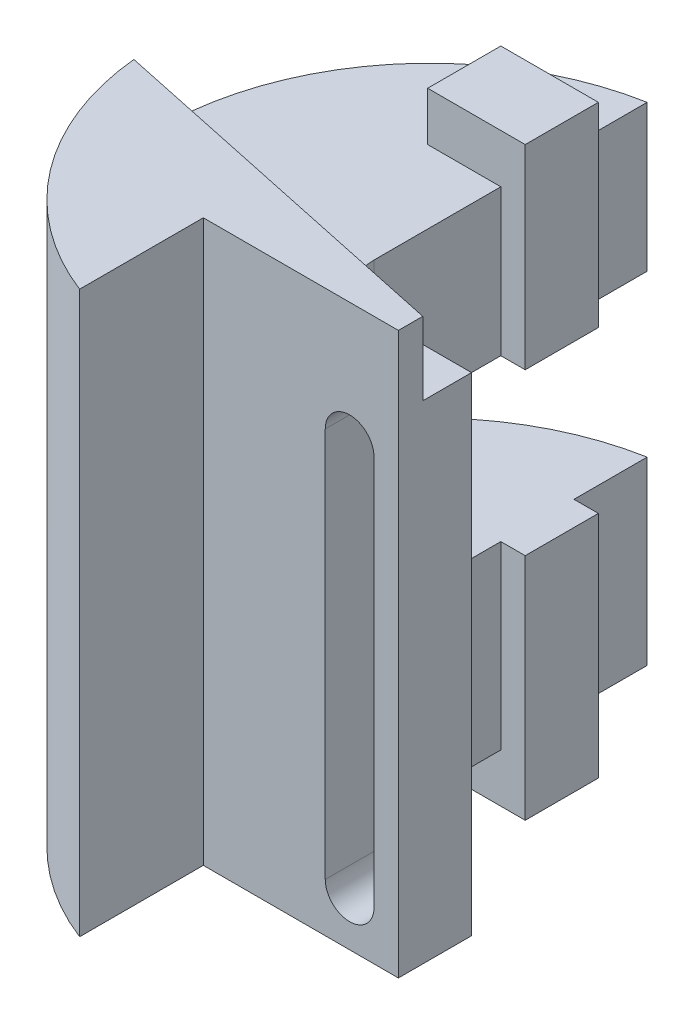
ISO-10303-21;
HEADER;
FILE_DESCRIPTION(('STEP AP214'),'2;1');
FILE_NAME('part.step','',(''),(''),'','','');
FILE_SCHEMA(('AUTOMOTIVE_DESIGN { 1 0 10303 214 1 1 1 1 }'));
ENDSEC;
DATA;
#1=APPLICATION_CONTEXT('core data for automotive mechanical design processes');
#2=APPLICATION_PROTOCOL_DEFINITION('international standard','automotive_design',2000,#1);
#3=PRODUCT_CONTEXT('',#1,'mechanical');
#4=PRODUCT('Part','Part','',(#3));
#5=PRODUCT_RELATED_PRODUCT_CATEGORY('part','',(#4));
#6=PRODUCT_DEFINITION_FORMATION('','',#4);
#7=PRODUCT_DEFINITION_CONTEXT('part definition',#1,'design');
#8=PRODUCT_DEFINITION('design','',#6,#7);
#9=PRODUCT_DEFINITION_SHAPE('','',#8);
#10=(LENGTH_UNIT() NAMED_UNIT(*) SI_UNIT(.MILLI.,.METRE.));
#11=(NAMED_UNIT(*) PLANE_ANGLE_UNIT() SI_UNIT($,.RADIAN.));
#12=(NAMED_UNIT(*) SI_UNIT($,.STERADIAN.) SOLID_ANGLE_UNIT());
#13=UNCERTAINTY_MEASURE_WITH_UNIT(LENGTH_MEASURE(1.E-05),#10,'distance_accuracy_value','');
#14=(GEOMETRIC_REPRESENTATION_CONTEXT(3) GLOBAL_UNCERTAINTY_ASSIGNED_CONTEXT((#13)) GLOBAL_UNIT_ASSIGNED_CONTEXT((#10,
#11,#12)) REPRESENTATION_CONTEXT('',''));
#15=CARTESIAN_POINT('',(0.,0.,0.));
#16=DIRECTION('',(0.,0.,1.));
#17=DIRECTION('',(1.,0.,0.));
#18=AXIS2_PLACEMENT_3D('',#15,#16,#17);
#19=CARTESIAN_POINT('',(5.,100.,30.));
#20=DIRECTION('',(0.,0.,-1.));
#21=DIRECTION('',(-1.,0.,0.));
#22=AXIS2_PLACEMENT_3D('',#19,#20,#21);
#23=PLANE('',#22);
#24=DIRECTION('',(0.,-1.,0.));
#25=VECTOR('',#24,1.);
#26=CARTESIAN_POINT('',(5.,100.,30.));
#27=LINE('',#26,#25);
#28=CARTESIAN_POINT('',(5.,37.,30.));
#29=VERTEX_POINT('',#28);
#30=CARTESIAN_POINT('',(5.,-10.,30.));
#31=VERTEX_POINT('',#30);
#32=EDGE_CURVE('E259',#29,#31,#27,.T.);
#33=ORIENTED_EDGE('',*,*,#32,.F.);
#34=DIRECTION('',(-1.,0.,0.));
#35=VECTOR('',#34,1.);
#36=CARTESIAN_POINT('',(5.,37.,30.));
#37=LINE('',#36,#35);
#38=CARTESIAN_POINT('',(0.,37.,30.));
#39=VERTEX_POINT('',#38);
#40=EDGE_CURVE('E515',#29,#39,#37,.T.);
#41=ORIENTED_EDGE('',*,*,#40,.T.);
#42=DIRECTION('',(0.,-1.,0.));
#43=VECTOR('',#42,1.);
#44=CARTESIAN_POINT('',(0.,100.,30.));
#45=LINE('',#44,#43);
#46=CARTESIAN_POINT('',(0.,0.,30.));
#47=VERTEX_POINT('',#46);
#48=EDGE_CURVE('E270',#39,#47,#45,.T.);
#49=ORIENTED_EDGE('',*,*,#48,.T.);
#50=DIRECTION('',(-1.,0.,0.));
#51=VECTOR('',#50,1.);
#52=CARTESIAN_POINT('',(5.,0.,30.));
#53=LINE('',#52,#51);
#54=CARTESIAN_POINT('',(-15.,0.,30.));
#55=VERTEX_POINT('',#54);
#56=EDGE_CURVE('E299',#47,#55,#53,.T.);
#57=ORIENTED_EDGE('',*,*,#56,.T.);
#58=DIRECTION('',(0.,1.,0.));
#59=VECTOR('',#58,1.);
#60=CARTESIAN_POINT('',(-15.,-10.,30.));
#61=LINE('',#60,#59);
#62=CARTESIAN_POINT('',(-15.,-10.,30.));
#63=VERTEX_POINT('',#62);
#64=EDGE_CURVE('E439',#63,#55,#61,.T.);
#65=ORIENTED_EDGE('',*,*,#64,.F.);
#66=DIRECTION('',(-1.,0.,0.));
#67=VECTOR('',#66,1.);
#68=CARTESIAN_POINT('',(5.,-10.,30.));
#69=LINE('',#68,#67);
#70=EDGE_CURVE('E478',#31,#63,#69,.T.);
#71=ORIENTED_EDGE('',*,*,#70,.F.);
#72=EDGE_LOOP('',(#33,#41,#49,#57,#65,#71));
#73=FACE_BOUND('',#72,.T.);
#74=ADVANCED_FACE('F45',(#73),#23,.F.);
#75=CARTESIAN_POINT('',(5.,100.,15.));
#76=DIRECTION('',(-1.,0.,0.));
#77=DIRECTION('',(0.,0.,1.));
#78=AXIS2_PLACEMENT_3D('',#75,#76,#77);
#79=PLANE('',#78);
#80=DIRECTION('',(0.,-1.,0.));
#81=VECTOR('',#80,1.);
#82=CARTESIAN_POINT('',(5.,100.,15.));
#83=LINE('',#82,#81);
#84=CARTESIAN_POINT('',(5.,37.,15.));
#85=VERTEX_POINT('',#84);
#86=CARTESIAN_POINT('',(5.,-10.,15.));
#87=VERTEX_POINT('',#86);
#88=EDGE_CURVE('E260',#85,#87,#83,.T.);
#89=ORIENTED_EDGE('',*,*,#88,.F.);
#90=DIRECTION('',(0.,0.,-1.));
#91=VECTOR('',#90,1.);
#92=CARTESIAN_POINT('',(5.,37.,40.));
#93=LINE('',#92,#91);
#94=EDGE_CURVE('E252',#29,#85,#93,.T.);
#95=ORIENTED_EDGE('',*,*,#94,.F.);
#96=ORIENTED_EDGE('',*,*,#32,.T.);
#97=DIRECTION('',(0.,0.,1.));
#98=VECTOR('',#97,1.);
#99=CARTESIAN_POINT('',(5.,-10.,15.));
#100=LINE('',#99,#98);
#101=EDGE_CURVE('E463',#87,#31,#100,.T.);
#102=ORIENTED_EDGE('',*,*,#101,.F.);
#103=EDGE_LOOP('',(#89,#95,#96,#102));
#104=FACE_BOUND('',#103,.T.);
#105=ADVANCED_FACE('F545',(#104),#79,.F.);
#106=CARTESIAN_POINT('',(0.,100.,15.));
#107=DIRECTION('',(0.,0.,1.));
#108=DIRECTION('',(1.,0.,0.));
#109=AXIS2_PLACEMENT_3D('',#106,#107,#108);
#110=PLANE('',#109);
#111=DIRECTION('',(0.,-1.,0.));
#112=VECTOR('',#111,1.);
#113=CARTESIAN_POINT('',(0.,100.,15.));
#114=LINE('',#113,#112);
#115=CARTESIAN_POINT('',(0.,37.,15.));
#116=VERTEX_POINT('',#115);
#117=CARTESIAN_POINT('',(0.,0.,15.));
#118=VERTEX_POINT('',#117);
#119=EDGE_CURVE('E311',#116,#118,#114,.T.);
#120=ORIENTED_EDGE('',*,*,#119,.F.);
#121=DIRECTION('',(1.,0.,0.));
#122=VECTOR('',#121,1.);
#123=CARTESIAN_POINT('',(0.,37.,15.));
#124=LINE('',#123,#122);
#125=EDGE_CURVE('E320',#116,#85,#124,.T.);
#126=ORIENTED_EDGE('',*,*,#125,.T.);
#127=ORIENTED_EDGE('',*,*,#88,.T.);
#128=DIRECTION('',(1.,0.,0.));
#129=VECTOR('',#128,1.);
#130=CARTESIAN_POINT('',(-15.,-10.,15.));
#131=LINE('',#130,#129);
#132=CARTESIAN_POINT('',(-15.,-10.,15.));
#133=VERTEX_POINT('',#132);
#134=EDGE_CURVE('E460',#133,#87,#131,.T.);
#135=ORIENTED_EDGE('',*,*,#134,.F.);
#136=DIRECTION('',(0.,1.,0.));
#137=VECTOR('',#136,1.);
#138=CARTESIAN_POINT('',(-15.,-10.,15.));
#139=LINE('',#138,#137);
#140=CARTESIAN_POINT('',(-15.,0.,15.));
#141=VERTEX_POINT('',#140);
#142=EDGE_CURVE('E457',#133,#141,#139,.T.);
#143=ORIENTED_EDGE('',*,*,#142,.T.);
#144=DIRECTION('',(1.,0.,0.));
#145=VECTOR('',#144,1.);
#146=CARTESIAN_POINT('',(-15.,0.,15.));
#147=LINE('',#146,#145);
#148=EDGE_CURVE('E323',#141,#118,#147,.T.);
#149=ORIENTED_EDGE('',*,*,#148,.T.);
#150=EDGE_LOOP('',(#120,#126,#127,#135,#143,#149));
#151=FACE_BOUND('',#150,.T.);
#152=ADVANCED_FACE('F319',(#151),#110,.F.);
#153=CARTESIAN_POINT('',(0.,100.,0.));
#154=DIRECTION('',(-1.,0.,0.));
#155=DIRECTION('',(0.,0.,1.));
#156=AXIS2_PLACEMENT_3D('',#153,#154,#155);
#157=PLANE('',#156);
#158=DIRECTION('',(0.,-1.,0.));
#159=VECTOR('',#158,1.);
#160=CARTESIAN_POINT('',(0.,100.,0.));
#161=LINE('',#160,#159);
#162=CARTESIAN_POINT('',(0.,37.,0.));
#163=VERTEX_POINT('',#162);
#164=CARTESIAN_POINT('',(0.,0.,0.));
#165=VERTEX_POINT('',#164);
#166=EDGE_CURVE('E313',#163,#165,#161,.T.);
#167=ORIENTED_EDGE('',*,*,#166,.F.);
#168=DIRECTION('',(0.,0.,1.));
#169=VECTOR('',#168,1.);
#170=CARTESIAN_POINT('',(0.,37.,0.));
#171=LINE('',#170,#169);
#172=EDGE_CURVE('E54',#163,#116,#171,.T.);
#173=ORIENTED_EDGE('',*,*,#172,.T.);
#174=ORIENTED_EDGE('',*,*,#119,.T.);
#175=DIRECTION('',(0.,0.,-1.));
#176=VECTOR('',#175,1.);
#177=CARTESIAN_POINT('',(0.,0.,0.));
#178=LINE('',#177,#176);
#179=EDGE_CURVE('E335',#118,#165,#178,.T.);
#180=ORIENTED_EDGE('',*,*,#179,.T.);
#181=EDGE_LOOP('',(#167,#173,#174,#180));
#182=FACE_BOUND('',#181,.T.);
#183=ADVANCED_FACE('F309',(#182),#157,.F.);
#184=CARTESIAN_POINT('',(10.,100.,54.5916660306315));
#185=DIRECTION('',(0.,1.,0.));
#186=DIRECTION('',(0.,0.,1.));
#187=AXIS2_PLACEMENT_3D('',#184,#185,#186);
#188=PLANE('',#187);
#189=DIRECTION('',(0.,0.,1.));
#190=VECTOR('',#189,1.);
#191=CARTESIAN_POINT('',(-15.,100.,15.));
#192=LINE('',#191,#190);
#193=CARTESIAN_POINT('',(-15.,100.,15.));
#194=VERTEX_POINT('',#193);
#195=CARTESIAN_POINT('',(-15.,100.,30.));
#196=VERTEX_POINT('',#195);
#197=EDGE_CURVE('E494',#194,#196,#192,.T.);
#198=ORIENTED_EDGE('',*,*,#197,.F.);
#199=DIRECTION('',(1.,0.,0.));
#200=VECTOR('',#199,1.);
#201=CARTESIAN_POINT('',(10.,100.,15.));
#202=LINE('',#201,#200);
#203=CARTESIAN_POINT('',(0.,100.,15.));
#204=VERTEX_POINT('',#203);
#205=EDGE_CURVE('E300',#194,#204,#202,.T.);
#206=ORIENTED_EDGE('',*,*,#205,.T.);
#207=DIRECTION('',(0.,0.,-1.));
#208=VECTOR('',#207,1.);
#209=CARTESIAN_POINT('',(0.,100.,0.));
#210=LINE('',#209,#208);
#211=CARTESIAN_POINT('',(0.,100.,0.));
#212=VERTEX_POINT('',#211);
#213=EDGE_CURVE('E333',#204,#212,#210,.T.);
#214=ORIENTED_EDGE('',*,*,#213,.T.);
#215=CARTESIAN_POINT('',(10.,100.,54.5916660306315));
#216=DIRECTION('',(0.,1.,0.));
#217=DIRECTION('',(0.,0.,1.));
#218=AXIS2_PLACEMENT_3D('',#215,#216,#217);
#219=CIRCLE('',#218,55.5);
#220=CARTESIAN_POINT('',(-45.2350441418964,100.,60.0082977001064));
#221=VERTEX_POINT('',#220);
#222=EDGE_CURVE('E338',#212,#221,#219,.T.);
#223=ORIENTED_EDGE('',*,*,#222,.T.);
#224=DIRECTION('',(-0.978147600733806,0.,-0.207911690817756));
#225=VECTOR('',#224,1.);
#226=CARTESIAN_POINT('',(30.,100.,76.));
#227=LINE('',#226,#225);
#228=CARTESIAN_POINT('',(30.,100.,76.));
#229=VERTEX_POINT('',#228);
#230=EDGE_CURVE('E388',#229,#221,#227,.T.);
#231=ORIENTED_EDGE('',*,*,#230,.F.);
#232=DIRECTION('',(0.,0.,-1.));
#233=VECTOR('',#232,1.);
#234=CARTESIAN_POINT('',(30.,100.,66.));
#235=LINE('',#234,#233);
#236=CARTESIAN_POINT('',(30.,100.,66.));
#237=VERTEX_POINT('',#236);
#238=EDGE_CURVE('E375',#229,#237,#235,.T.);
#239=ORIENTED_EDGE('',*,*,#238,.T.);
#240=DIRECTION('',(-1.,0.,0.));
#241=VECTOR('',#240,1.);
#242=CARTESIAN_POINT('',(10.,100.,66.));
#243=LINE('',#242,#241);
#244=CARTESIAN_POINT('',(10.,100.,66.));
#245=VERTEX_POINT('',#244);
#246=EDGE_CURVE('E372',#237,#245,#243,.T.);
#247=ORIENTED_EDGE('',*,*,#246,.T.);
#248=CARTESIAN_POINT('',(10.,100.,56.));
#249=DIRECTION('',(0.,-1.,0.));
#250=DIRECTION('',(0.,0.,1.));
#251=AXIS2_PLACEMENT_3D('',#248,#249,#250);
#252=CIRCLE('',#251,10.);
#253=CARTESIAN_POINT('',(0.,100.,56.));
#254=VERTEX_POINT('',#253);
#255=EDGE_CURVE('E369',#245,#254,#252,.T.);
#256=ORIENTED_EDGE('',*,*,#255,.T.);
#257=DIRECTION('',(0.,0.,-1.));
#258=VECTOR('',#257,1.);
#259=CARTESIAN_POINT('',(0.,100.,30.));
#260=LINE('',#259,#258);
#261=CARTESIAN_POINT('',(0.,100.,30.));
#262=VERTEX_POINT('',#261);
#263=EDGE_CURVE('E365',#254,#262,#260,.T.);
#264=ORIENTED_EDGE('',*,*,#263,.T.);
#265=DIRECTION('',(1.,0.,0.));
#266=VECTOR('',#265,1.);
#267=CARTESIAN_POINT('',(-15.,100.,30.));
#268=LINE('',#267,#266);
#269=EDGE_CURVE('E490',#196,#262,#268,.T.);
#270=ORIENTED_EDGE('',*,*,#269,.F.);
#271=EDGE_LOOP('',(#198,#206,#214,#223,#231,#239,#247,#256,#264,#270));
#272=FACE_BOUND('',#271,.T.);
#273=ADVANCED_FACE('F604',(#272),#188,.T.);
#274=CARTESIAN_POINT('',(10.,0.,54.5916660306315));
#275=DIRECTION('',(0.,1.,0.));
#276=DIRECTION('',(0.,0.,1.));
#277=AXIS2_PLACEMENT_3D('',#274,#275,#276);
#278=PLANE('',#277);
#279=ORIENTED_EDGE('',*,*,#148,.F.);
#280=DIRECTION('',(0.,0.,-1.));
#281=VECTOR('',#280,1.);
#282=CARTESIAN_POINT('',(-15.,0.,30.));
#283=LINE('',#282,#281);
#284=EDGE_CURVE('E464',#55,#141,#283,.T.);
#285=ORIENTED_EDGE('',*,*,#284,.F.);
#286=ORIENTED_EDGE('',*,*,#56,.F.);
#287=DIRECTION('',(0.,0.,-1.));
#288=VECTOR('',#287,1.);
#289=CARTESIAN_POINT('',(0.,0.,30.));
#290=LINE('',#289,#288);
#291=CARTESIAN_POINT('',(0.,0.,56.));
#292=VERTEX_POINT('',#291);
#293=EDGE_CURVE('E339',#292,#47,#290,.T.);
#294=ORIENTED_EDGE('',*,*,#293,.F.);
#295=CARTESIAN_POINT('',(10.,0.,56.));
#296=DIRECTION('',(0.,-1.,0.));
#297=DIRECTION('',(0.,0.,1.));
#298=AXIS2_PLACEMENT_3D('',#295,#296,#297);
#299=CIRCLE('',#298,10.);
#300=CARTESIAN_POINT('',(10.,0.,66.));
#301=VERTEX_POINT('',#300);
#302=EDGE_CURVE('E343',#301,#292,#299,.T.);
#303=ORIENTED_EDGE('',*,*,#302,.F.);
#304=DIRECTION('',(-1.,0.,0.));
#305=VECTOR('',#304,1.);
#306=CARTESIAN_POINT('',(10.,0.,66.));
#307=LINE('',#306,#305);
#308=CARTESIAN_POINT('',(30.,0.,66.));
#309=VERTEX_POINT('',#308);
#310=EDGE_CURVE('E346',#309,#301,#307,.T.);
#311=ORIENTED_EDGE('',*,*,#310,.F.);
#312=DIRECTION('',(0.,0.,-1.));
#313=VECTOR('',#312,1.);
#314=CARTESIAN_POINT('',(30.,0.,66.));
#315=LINE('',#314,#313);
#316=CARTESIAN_POINT('',(30.,0.,81.));
#317=VERTEX_POINT('',#316);
#318=EDGE_CURVE('E349',#317,#309,#315,.T.);
#319=ORIENTED_EDGE('',*,*,#318,.F.);
#320=DIRECTION('',(1.,0.,0.));
#321=VECTOR('',#320,1.);
#322=CARTESIAN_POINT('',(30.,0.,81.));
#323=LINE('',#322,#321);
#324=CARTESIAN_POINT('',(-9.99999999999999,0.,81.));
#325=VERTEX_POINT('',#324);
#326=EDGE_CURVE('E352',#325,#317,#323,.T.);
#327=ORIENTED_EDGE('',*,*,#326,.F.);
#328=DIRECTION('',(0.,0.,-1.));
#329=VECTOR('',#328,1.);
#330=CARTESIAN_POINT('',(-9.99999999999999,0.,81.));
#331=LINE('',#330,#329);
#332=CARTESIAN_POINT('',(-9.99999999999999,0.,106.362796982157));
#333=VERTEX_POINT('',#332);
#334=EDGE_CURVE('E355',#333,#325,#331,.T.);
#335=ORIENTED_EDGE('',*,*,#334,.F.);
#336=CARTESIAN_POINT('',(10.,0.,54.5916660306315));
#337=DIRECTION('',(0.,1.,0.));
#338=DIRECTION('',(0.,0.,1.));
#339=AXIS2_PLACEMENT_3D('',#336,#337,#338);
#340=CIRCLE('',#339,55.5);
#341=EDGE_CURVE('E358',#165,#333,#340,.T.);
#342=ORIENTED_EDGE('',*,*,#341,.F.);
#343=ORIENTED_EDGE('',*,*,#179,.F.);
#344=EDGE_LOOP('',(#279,#285,#286,#294,#303,#311,#319,#327,#335,#342,#343));
#345=FACE_BOUND('',#344,.T.);
#346=ADVANCED_FACE('F560',(#345),#278,.F.);
#347=CARTESIAN_POINT('',(10.,100.,54.5916660306315));
#348=DIRECTION('',(0.,-1.,0.));
#349=DIRECTION('',(0.,0.,-1.));
#350=AXIS2_PLACEMENT_3D('',#347,#348,#349);
#351=CYLINDRICAL_SURFACE('',#350,55.5);
#352=DIRECTION('',(0.,-1.,0.));
#353=VECTOR('',#352,1.);
#354=CARTESIAN_POINT('',(-43.5474862383895,100.,40.));
#355=LINE('',#354,#353);
#356=CARTESIAN_POINT('',(-43.5474862383895,70.,40.));
#357=VERTEX_POINT('',#356);
#358=CARTESIAN_POINT('',(-43.5474862383895,37.,40.));
#359=VERTEX_POINT('',#358);
#360=EDGE_CURVE('E497',#357,#359,#355,.T.);
#361=ORIENTED_EDGE('',*,*,#360,.T.);
#362=CARTESIAN_POINT('',(10.,37.,54.5916660306315));
#363=DIRECTION('',(0.,-1.,0.));
#364=DIRECTION('',(0.,0.,-1.));
#365=AXIS2_PLACEMENT_3D('',#362,#363,#364);
#366=CIRCLE('',#365,55.5);
#367=EDGE_CURVE('E519',#359,#163,#366,.T.);
#368=ORIENTED_EDGE('',*,*,#367,.T.);
#369=ORIENTED_EDGE('',*,*,#166,.T.);
#370=ORIENTED_EDGE('',*,*,#341,.T.);
#371=DIRECTION('',(0.,-1.,0.));
#372=VECTOR('',#371,1.);
#373=CARTESIAN_POINT('',(-9.99999999999999,100.,106.362796982157));
#374=LINE('',#373,#372);
#375=CARTESIAN_POINT('',(-9.99999999999998,115.,106.362796982157));
#376=VERTEX_POINT('',#375);
#377=EDGE_CURVE('E295',#376,#333,#374,.T.);
#378=ORIENTED_EDGE('',*,*,#377,.F.);
#379=CARTESIAN_POINT('',(10.,115.,54.5916660306315));
#380=DIRECTION('',(0.,1.,0.));
#381=DIRECTION('',(0.,0.,-1.));
#382=AXIS2_PLACEMENT_3D('',#379,#380,#381);
#383=CIRCLE('',#382,55.5);
#384=CARTESIAN_POINT('',(-45.2350441418964,115.,60.0082977001064));
#385=VERTEX_POINT('',#384);
#386=EDGE_CURVE('E397',#385,#376,#383,.T.);
#387=ORIENTED_EDGE('',*,*,#386,.F.);
#388=DIRECTION('',(0.,-1.,0.));
#389=VECTOR('',#388,1.);
#390=CARTESIAN_POINT('',(-45.2350441418964,115.,60.0082977001064));
#391=LINE('',#390,#389);
#392=EDGE_CURVE('E383',#385,#221,#391,.T.);
#393=ORIENTED_EDGE('',*,*,#392,.T.);
#394=ORIENTED_EDGE('',*,*,#222,.F.);
#395=CARTESIAN_POINT('',(0.,70.,0.));
#396=VERTEX_POINT('',#395);
#397=EDGE_CURVE('E325',#212,#396,#161,.T.);
#398=ORIENTED_EDGE('',*,*,#397,.T.);
#399=CARTESIAN_POINT('',(10.,70.,54.5916660306315));
#400=DIRECTION('',(0.,1.,0.));
#401=DIRECTION('',(0.,0.,1.));
#402=AXIS2_PLACEMENT_3D('',#399,#400,#401);
#403=CIRCLE('',#402,55.5);
#404=EDGE_CURVE('E61',#396,#357,#403,.T.);
#405=ORIENTED_EDGE('',*,*,#404,.T.);
#406=EDGE_LOOP('',(#361,#368,#369,#370,#378,#387,#393,#394,#398,#405));
#407=FACE_BOUND('',#406,.T.);
#408=ADVANCED_FACE('F47',(#407),#351,.T.);
#409=CARTESIAN_POINT('',(-9.99999999999999,100.,81.));
#410=DIRECTION('',(-1.,0.,0.));
#411=DIRECTION('',(0.,0.,1.));
#412=AXIS2_PLACEMENT_3D('',#409,#410,#411);
#413=PLANE('',#412);
#414=ORIENTED_EDGE('',*,*,#334,.T.);
#415=DIRECTION('',(0.,-1.,0.));
#416=VECTOR('',#415,1.);
#417=CARTESIAN_POINT('',(-9.99999999999999,100.,81.));
#418=LINE('',#417,#416);
#419=CARTESIAN_POINT('',(-9.99999999999999,115.,81.));
#420=VERTEX_POINT('',#419);
#421=EDGE_CURVE('E291',#420,#325,#418,.T.);
#422=ORIENTED_EDGE('',*,*,#421,.F.);
#423=DIRECTION('',(0.,0.,-1.));
#424=VECTOR('',#423,1.);
#425=CARTESIAN_POINT('',(-9.99999999999999,115.,81.));
#426=LINE('',#425,#424);
#427=EDGE_CURVE('E387',#376,#420,#426,.T.);
#428=ORIENTED_EDGE('',*,*,#427,.F.);
#429=ORIENTED_EDGE('',*,*,#377,.T.);
#430=EDGE_LOOP('',(#414,#422,#428,#429));
#431=FACE_BOUND('',#430,.T.);
#432=ADVANCED_FACE('F590',(#431),#413,.F.);
#433=CARTESIAN_POINT('',(30.,100.,81.));
#434=DIRECTION('',(0.,0.,-1.));
#435=DIRECTION('',(-1.,0.,0.));
#436=AXIS2_PLACEMENT_3D('',#433,#434,#435);
#437=PLANE('',#436);
#438=DIRECTION('',(0.,1.,0.));
#439=VECTOR('',#438,1.);
#440=CARTESIAN_POINT('',(15.,90.,81.));
#441=LINE('',#440,#439);
#442=CARTESIAN_POINT('',(15.,10.,81.));
#443=VERTEX_POINT('',#442);
#444=CARTESIAN_POINT('',(15.,90.,81.));
#445=VERTEX_POINT('',#444);
#446=EDGE_CURVE('E415',#443,#445,#441,.T.);
#447=ORIENTED_EDGE('',*,*,#446,.T.);
#448=CARTESIAN_POINT('',(20.,90.,81.));
#449=DIRECTION('',(0.,0.,-1.));
#450=DIRECTION('',(-1.,0.,0.));
#451=AXIS2_PLACEMENT_3D('',#448,#449,#450);
#452=CIRCLE('',#451,5.);
#453=CARTESIAN_POINT('',(25.,90.,81.));
#454=VERTEX_POINT('',#453);
#455=EDGE_CURVE('E427',#445,#454,#452,.T.);
#456=ORIENTED_EDGE('',*,*,#455,.T.);
#457=DIRECTION('',(0.,-1.,0.));
#458=VECTOR('',#457,1.);
#459=CARTESIAN_POINT('',(25.,90.,81.));
#460=LINE('',#459,#458);
#461=CARTESIAN_POINT('',(25.,9.99999999999999,81.));
#462=VERTEX_POINT('',#461);
#463=EDGE_CURVE('E447',#454,#462,#460,.T.);
#464=ORIENTED_EDGE('',*,*,#463,.T.);
#465=CARTESIAN_POINT('',(20.,10.,81.));
#466=DIRECTION('',(0.,0.,-1.));
#467=DIRECTION('',(-1.,0.,0.));
#468=AXIS2_PLACEMENT_3D('',#465,#466,#467);
#469=CIRCLE('',#468,5.);
#470=EDGE_CURVE('E443',#462,#443,#469,.T.);
#471=ORIENTED_EDGE('',*,*,#470,.T.);
#472=EDGE_LOOP('',(#447,#456,#464,#471));
#473=FACE_BOUND('',#472,.T.);
#474=ORIENTED_EDGE('',*,*,#326,.T.);
#475=DIRECTION('',(0.,-1.,0.));
#476=VECTOR('',#475,1.);
#477=CARTESIAN_POINT('',(30.,100.,81.));
#478=LINE('',#477,#476);
#479=CARTESIAN_POINT('',(30.,115.,81.));
#480=VERTEX_POINT('',#479);
#481=EDGE_CURVE('E287',#480,#317,#478,.T.);
#482=ORIENTED_EDGE('',*,*,#481,.F.);
#483=DIRECTION('',(1.,0.,0.));
#484=VECTOR('',#483,1.);
#485=CARTESIAN_POINT('',(30.,115.,81.));
#486=LINE('',#485,#484);
#487=EDGE_CURVE('E392',#420,#480,#486,.T.);
#488=ORIENTED_EDGE('',*,*,#487,.F.);
#489=ORIENTED_EDGE('',*,*,#421,.T.);
#490=EDGE_LOOP('',(#474,#482,#488,#489));
#491=FACE_BOUND('',#490,.T.);
#492=ADVANCED_FACE('F586',(#473,#491),#437,.F.);
#493=CARTESIAN_POINT('',(30.,100.,66.));
#494=DIRECTION('',(-1.,0.,0.));
#495=DIRECTION('',(0.,0.,1.));
#496=AXIS2_PLACEMENT_3D('',#493,#494,#495);
#497=PLANE('',#496);
#498=ORIENTED_EDGE('',*,*,#318,.T.);
#499=DIRECTION('',(0.,-1.,0.));
#500=VECTOR('',#499,1.);
#501=CARTESIAN_POINT('',(30.,100.,66.));
#502=LINE('',#501,#500);
#503=EDGE_CURVE('E283',#237,#309,#502,.T.);
#504=ORIENTED_EDGE('',*,*,#503,.F.);
#505=ORIENTED_EDGE('',*,*,#238,.F.);
#506=DIRECTION('',(0.,-1.,0.));
#507=VECTOR('',#506,1.);
#508=CARTESIAN_POINT('',(30.,115.,76.));
#509=LINE('',#508,#507);
#510=CARTESIAN_POINT('',(30.,115.,76.));
#511=VERTEX_POINT('',#510);
#512=EDGE_CURVE('E362',#511,#229,#509,.T.);
#513=ORIENTED_EDGE('',*,*,#512,.F.);
#514=DIRECTION('',(0.,0.,-1.));
#515=VECTOR('',#514,1.);
#516=CARTESIAN_POINT('',(30.,115.,81.));
#517=LINE('',#516,#515);
#518=EDGE_CURVE('E404',#480,#511,#517,.T.);
#519=ORIENTED_EDGE('',*,*,#518,.F.);
#520=ORIENTED_EDGE('',*,*,#481,.T.);
#521=EDGE_LOOP('',(#498,#504,#505,#513,#519,#520));
#522=FACE_BOUND('',#521,.T.);
#523=ADVANCED_FACE('F580',(#522),#497,.F.);
#524=CARTESIAN_POINT('',(10.,100.,66.));
#525=DIRECTION('',(0.,0.,1.));
#526=DIRECTION('',(1.,0.,0.));
#527=AXIS2_PLACEMENT_3D('',#524,#525,#526);
#528=PLANE('',#527);
#529=DIRECTION('',(0.,-1.,0.));
#530=VECTOR('',#529,1.);
#531=CARTESIAN_POINT('',(25.,90.,66.));
#532=LINE('',#531,#530);
#533=CARTESIAN_POINT('',(25.,90.,66.));
#534=VERTEX_POINT('',#533);
#535=CARTESIAN_POINT('',(25.,10.,66.));
#536=VERTEX_POINT('',#535);
#537=EDGE_CURVE('E432',#534,#536,#532,.T.);
#538=ORIENTED_EDGE('',*,*,#537,.F.);
#539=CARTESIAN_POINT('',(20.,90.,66.));
#540=DIRECTION('',(0.,0.,-1.));
#541=DIRECTION('',(-1.,0.,0.));
#542=AXIS2_PLACEMENT_3D('',#539,#540,#541);
#543=CIRCLE('',#542,5.);
#544=CARTESIAN_POINT('',(15.,90.,66.));
#545=VERTEX_POINT('',#544);
#546=EDGE_CURVE('E436',#545,#534,#543,.T.);
#547=ORIENTED_EDGE('',*,*,#546,.F.);
#548=DIRECTION('',(0.,1.,0.));
#549=VECTOR('',#548,1.);
#550=CARTESIAN_POINT('',(15.,90.,66.));
#551=LINE('',#550,#549);
#552=CARTESIAN_POINT('',(15.,10.,66.));
#553=VERTEX_POINT('',#552);
#554=EDGE_CURVE('E423',#553,#545,#551,.T.);
#555=ORIENTED_EDGE('',*,*,#554,.F.);
#556=CARTESIAN_POINT('',(20.,10.,66.));
#557=DIRECTION('',(0.,0.,-1.));
#558=DIRECTION('',(-1.,0.,0.));
#559=AXIS2_PLACEMENT_3D('',#556,#557,#558);
#560=CIRCLE('',#559,5.);
#561=EDGE_CURVE('E428',#536,#553,#560,.T.);
#562=ORIENTED_EDGE('',*,*,#561,.F.);
#563=EDGE_LOOP('',(#538,#547,#555,#562));
#564=FACE_BOUND('',#563,.T.);
#565=ORIENTED_EDGE('',*,*,#310,.T.);
#566=DIRECTION('',(0.,-1.,0.));
#567=VECTOR('',#566,1.);
#568=CARTESIAN_POINT('',(10.,100.,66.));
#569=LINE('',#568,#567);
#570=EDGE_CURVE('E279',#245,#301,#569,.T.);
#571=ORIENTED_EDGE('',*,*,#570,.F.);
#572=ORIENTED_EDGE('',*,*,#246,.F.);
#573=ORIENTED_EDGE('',*,*,#503,.T.);
#574=EDGE_LOOP('',(#565,#571,#572,#573));
#575=FACE_BOUND('',#574,.T.);
#576=ADVANCED_FACE('F576',(#564,#575),#528,.F.);
#577=CARTESIAN_POINT('',(10.,100.,56.));
#578=DIRECTION('',(0.,-1.,0.));
#579=DIRECTION('',(0.,0.,-1.));
#580=AXIS2_PLACEMENT_3D('',#577,#578,#579);
#581=CYLINDRICAL_SURFACE('',#580,10.);
#582=ORIENTED_EDGE('',*,*,#302,.T.);
#583=DIRECTION('',(0.,-1.,0.));
#584=VECTOR('',#583,1.);
#585=CARTESIAN_POINT('',(0.,100.,56.));
#586=LINE('',#585,#584);
#587=EDGE_CURVE('E275',#254,#292,#586,.T.);
#588=ORIENTED_EDGE('',*,*,#587,.F.);
#589=ORIENTED_EDGE('',*,*,#255,.F.);
#590=ORIENTED_EDGE('',*,*,#570,.T.);
#591=EDGE_LOOP('',(#582,#588,#589,#590));
#592=FACE_BOUND('',#591,.T.);
#593=ADVANCED_FACE('F571',(#592),#581,.F.);
#594=CARTESIAN_POINT('',(0.,100.,30.));
#595=DIRECTION('',(-1.,0.,0.));
#596=DIRECTION('',(0.,0.,1.));
#597=AXIS2_PLACEMENT_3D('',#594,#595,#596);
#598=PLANE('',#597);
#599=ORIENTED_EDGE('',*,*,#48,.F.);
#600=DIRECTION('',(0.,0.,1.));
#601=VECTOR('',#600,1.);
#602=CARTESIAN_POINT('',(0.,37.,30.));
#603=LINE('',#602,#601);
#604=CARTESIAN_POINT('',(0.,37.,40.));
#605=VERTEX_POINT('',#604);
#606=EDGE_CURVE('E511',#39,#605,#603,.T.);
#607=ORIENTED_EDGE('',*,*,#606,.T.);
#608=DIRECTION('',(0.,1.,0.));
#609=VECTOR('',#608,1.);
#610=CARTESIAN_POINT('',(0.,100.,40.));
#611=LINE('',#610,#609);
#612=CARTESIAN_POINT('',(0.,70.,40.));
#613=VERTEX_POINT('',#612);
#614=EDGE_CURVE('E11',#605,#613,#611,.T.);
#615=ORIENTED_EDGE('',*,*,#614,.T.);
#616=DIRECTION('',(0.,0.,-1.));
#617=VECTOR('',#616,1.);
#618=CARTESIAN_POINT('',(0.,70.,30.));
#619=LINE('',#618,#617);
#620=CARTESIAN_POINT('',(0.,70.,30.));
#621=VERTEX_POINT('',#620);
#622=EDGE_CURVE('E524',#613,#621,#619,.T.);
#623=ORIENTED_EDGE('',*,*,#622,.T.);
#624=EDGE_CURVE('E271',#262,#621,#45,.T.);
#625=ORIENTED_EDGE('',*,*,#624,.F.);
#626=ORIENTED_EDGE('',*,*,#263,.F.);
#627=ORIENTED_EDGE('',*,*,#587,.T.);
#628=ORIENTED_EDGE('',*,*,#293,.T.);
#629=EDGE_LOOP('',(#599,#607,#615,#623,#625,#626,#627,#628));
#630=FACE_BOUND('',#629,.T.);
#631=ADVANCED_FACE('F564',(#630),#598,.F.);
#632=ORIENTED_EDGE('',*,*,#624,.T.);
#633=DIRECTION('',(1.,0.,0.));
#634=VECTOR('',#633,1.);
#635=CARTESIAN_POINT('',(5.,70.,30.));
#636=LINE('',#635,#634);
#637=CARTESIAN_POINT('',(5.,70.,30.));
#638=VERTEX_POINT('',#637);
#639=EDGE_CURVE('E528',#621,#638,#636,.T.);
#640=ORIENTED_EDGE('',*,*,#639,.T.);
#641=CARTESIAN_POINT('',(5.,110.,30.));
#642=VERTEX_POINT('',#641);
#643=EDGE_CURVE('E250',#642,#638,#27,.T.);
#644=ORIENTED_EDGE('',*,*,#643,.F.);
#645=DIRECTION('',(1.,0.,0.));
#646=VECTOR('',#645,1.);
#647=CARTESIAN_POINT('',(-15.,110.,30.));
#648=LINE('',#647,#646);
#649=CARTESIAN_POINT('',(-15.,110.,30.));
#650=VERTEX_POINT('',#649);
#651=EDGE_CURVE('E489',#650,#642,#648,.T.);
#652=ORIENTED_EDGE('',*,*,#651,.F.);
#653=DIRECTION('',(0.,-1.,0.));
#654=VECTOR('',#653,1.);
#655=CARTESIAN_POINT('',(-15.,110.,30.));
#656=LINE('',#655,#654);
#657=EDGE_CURVE('E69',#650,#196,#656,.T.);
#658=ORIENTED_EDGE('',*,*,#657,.T.);
#659=ORIENTED_EDGE('',*,*,#269,.T.);
#660=EDGE_LOOP('',(#632,#640,#644,#652,#658,#659));
#661=FACE_BOUND('',#660,.T.);
#662=ADVANCED_FACE('F600',(#661),#23,.F.);
#663=ORIENTED_EDGE('',*,*,#643,.T.);
#664=DIRECTION('',(0.,0.,1.));
#665=VECTOR('',#664,1.);
#666=CARTESIAN_POINT('',(5.,70.,0.));
#667=LINE('',#666,#665);
#668=CARTESIAN_POINT('',(5.,70.,15.));
#669=VERTEX_POINT('',#668);
#670=EDGE_CURVE('E234',#669,#638,#667,.T.);
#671=ORIENTED_EDGE('',*,*,#670,.F.);
#672=CARTESIAN_POINT('',(5.,110.,15.));
#673=VERTEX_POINT('',#672);
#674=EDGE_CURVE('E248',#673,#669,#83,.T.);
#675=ORIENTED_EDGE('',*,*,#674,.F.);
#676=DIRECTION('',(0.,0.,-1.));
#677=VECTOR('',#676,1.);
#678=CARTESIAN_POINT('',(5.,110.,30.));
#679=LINE('',#678,#677);
#680=EDGE_CURVE('E493',#642,#673,#679,.T.);
#681=ORIENTED_EDGE('',*,*,#680,.F.);
#682=EDGE_LOOP('',(#663,#671,#675,#681));
#683=FACE_BOUND('',#682,.T.);
#684=ADVANCED_FACE('F246',(#683),#79,.F.);
#685=ORIENTED_EDGE('',*,*,#674,.T.);
#686=DIRECTION('',(-1.,0.,0.));
#687=VECTOR('',#686,1.);
#688=CARTESIAN_POINT('',(0.,70.,15.));
#689=LINE('',#688,#687);
#690=CARTESIAN_POINT('',(0.,70.,15.));
#691=VERTEX_POINT('',#690);
#692=EDGE_CURVE('E231',#669,#691,#689,.T.);
#693=ORIENTED_EDGE('',*,*,#692,.T.);
#694=EDGE_CURVE('E265',#204,#691,#114,.T.);
#695=ORIENTED_EDGE('',*,*,#694,.F.);
#696=ORIENTED_EDGE('',*,*,#205,.F.);
#697=DIRECTION('',(0.,-1.,0.));
#698=VECTOR('',#697,1.);
#699=CARTESIAN_POINT('',(-15.,110.,15.));
#700=LINE('',#699,#698);
#701=CARTESIAN_POINT('',(-15.,110.,15.));
#702=VERTEX_POINT('',#701);
#703=EDGE_CURVE('E468',#702,#194,#700,.T.);
#704=ORIENTED_EDGE('',*,*,#703,.F.);
#705=DIRECTION('',(-1.,0.,0.));
#706=VECTOR('',#705,1.);
#707=CARTESIAN_POINT('',(5.,110.,15.));
#708=LINE('',#707,#706);
#709=EDGE_CURVE('E256',#673,#702,#708,.T.);
#710=ORIENTED_EDGE('',*,*,#709,.F.);
#711=EDGE_LOOP('',(#685,#693,#695,#696,#704,#710));
#712=FACE_BOUND('',#711,.T.);
#713=ADVANCED_FACE('F254',(#712),#110,.F.);
#714=ORIENTED_EDGE('',*,*,#694,.T.);
#715=DIRECTION('',(0.,0.,-1.));
#716=VECTOR('',#715,1.);
#717=CARTESIAN_POINT('',(0.,70.,0.));
#718=LINE('',#717,#716);
#719=EDGE_CURVE('E236',#691,#396,#718,.T.);
#720=ORIENTED_EDGE('',*,*,#719,.T.);
#721=ORIENTED_EDGE('',*,*,#397,.F.);
#722=ORIENTED_EDGE('',*,*,#213,.F.);
#723=EDGE_LOOP('',(#714,#720,#721,#722));
#724=FACE_BOUND('',#723,.T.);
#725=ADVANCED_FACE('F608',(#724),#157,.F.);
#726=CARTESIAN_POINT('',(30.,115.,76.));
#727=DIRECTION('',(-0.207911690817756,0.,0.978147600733806));
#728=DIRECTION('',(0.978147600733806,0.,0.207911690817756));
#729=AXIS2_PLACEMENT_3D('',#726,#727,#728);
#730=PLANE('',#729);
#731=ORIENTED_EDGE('',*,*,#230,.T.);
#732=ORIENTED_EDGE('',*,*,#392,.F.);
#733=DIRECTION('',(-0.978147600733806,0.,-0.207911690817756));
#734=VECTOR('',#733,1.);
#735=CARTESIAN_POINT('',(30.,115.,76.));
#736=LINE('',#735,#734);
#737=EDGE_CURVE('E401',#511,#385,#736,.T.);
#738=ORIENTED_EDGE('',*,*,#737,.F.);
#739=ORIENTED_EDGE('',*,*,#512,.T.);
#740=EDGE_LOOP('',(#731,#732,#738,#739));
#741=FACE_BOUND('',#740,.T.);
#742=ADVANCED_FACE('F606',(#741),#730,.F.);
#743=CARTESIAN_POINT('',(10.,115.,54.5916660306315));
#744=DIRECTION('',(0.,-1.,0.));
#745=DIRECTION('',(0.,0.,-1.));
#746=AXIS2_PLACEMENT_3D('',#743,#744,#745);
#747=PLANE('',#746);
#748=ORIENTED_EDGE('',*,*,#487,.T.);
#749=ORIENTED_EDGE('',*,*,#518,.T.);
#750=ORIENTED_EDGE('',*,*,#737,.T.);
#751=ORIENTED_EDGE('',*,*,#386,.T.);
#752=ORIENTED_EDGE('',*,*,#427,.T.);
#753=EDGE_LOOP('',(#748,#749,#750,#751,#752));
#754=FACE_BOUND('',#753,.T.);
#755=ADVANCED_FACE('F592',(#754),#747,.F.);
#756=CARTESIAN_POINT('',(20.,90.,81.));
#757=DIRECTION('',(0.,0.,-1.));
#758=DIRECTION('',(-1.,0.,0.));
#759=AXIS2_PLACEMENT_3D('',#756,#757,#758);
#760=CYLINDRICAL_SURFACE('',#759,5.);
#761=ORIENTED_EDGE('',*,*,#546,.T.);
#762=DIRECTION('',(0.,0.,-1.));
#763=VECTOR('',#762,1.);
#764=CARTESIAN_POINT('',(25.,90.,81.));
#765=LINE('',#764,#763);
#766=EDGE_CURVE('E410',#454,#534,#765,.T.);
#767=ORIENTED_EDGE('',*,*,#766,.F.);
#768=ORIENTED_EDGE('',*,*,#455,.F.);
#769=DIRECTION('',(0.,0.,-1.));
#770=VECTOR('',#769,1.);
#771=CARTESIAN_POINT('',(15.,90.,81.));
#772=LINE('',#771,#770);
#773=EDGE_CURVE('E393',#445,#545,#772,.T.);
#774=ORIENTED_EDGE('',*,*,#773,.T.);
#775=EDGE_LOOP('',(#761,#767,#768,#774));
#776=FACE_BOUND('',#775,.T.);
#777=ADVANCED_FACE('F614',(#776),#760,.F.);
#778=CARTESIAN_POINT('',(15.,90.,81.));
#779=DIRECTION('',(-1.,0.,0.));
#780=DIRECTION('',(0.,-1.,0.));
#781=AXIS2_PLACEMENT_3D('',#778,#779,#780);
#782=PLANE('',#781);
#783=ORIENTED_EDGE('',*,*,#554,.T.);
#784=ORIENTED_EDGE('',*,*,#773,.F.);
#785=ORIENTED_EDGE('',*,*,#446,.F.);
#786=DIRECTION('',(0.,0.,-1.));
#787=VECTOR('',#786,1.);
#788=CARTESIAN_POINT('',(15.,10.,81.));
#789=LINE('',#788,#787);
#790=EDGE_CURVE('E418',#443,#553,#789,.T.);
#791=ORIENTED_EDGE('',*,*,#790,.T.);
#792=EDGE_LOOP('',(#783,#784,#785,#791));
#793=FACE_BOUND('',#792,.T.);
#794=ADVANCED_FACE('F777',(#793),#782,.F.);
#795=CARTESIAN_POINT('',(20.,10.,81.));
#796=DIRECTION('',(0.,0.,-1.));
#797=DIRECTION('',(-1.,0.,0.));
#798=AXIS2_PLACEMENT_3D('',#795,#796,#797);
#799=CYLINDRICAL_SURFACE('',#798,5.);
#800=ORIENTED_EDGE('',*,*,#561,.T.);
#801=ORIENTED_EDGE('',*,*,#790,.F.);
#802=ORIENTED_EDGE('',*,*,#470,.F.);
#803=DIRECTION('',(0.,0.,-1.));
#804=VECTOR('',#803,1.);
#805=CARTESIAN_POINT('',(25.,10.,81.));
#806=LINE('',#805,#804);
#807=EDGE_CURVE('E414',#462,#536,#806,.T.);
#808=ORIENTED_EDGE('',*,*,#807,.T.);
#809=EDGE_LOOP('',(#800,#801,#802,#808));
#810=FACE_BOUND('',#809,.T.);
#811=ADVANCED_FACE('F787',(#810),#799,.F.);
#812=CARTESIAN_POINT('',(25.,90.,81.));
#813=DIRECTION('',(1.,0.,0.));
#814=DIRECTION('',(0.,1.,0.));
#815=AXIS2_PLACEMENT_3D('',#812,#813,#814);
#816=PLANE('',#815);
#817=ORIENTED_EDGE('',*,*,#537,.T.);
#818=ORIENTED_EDGE('',*,*,#807,.F.);
#819=ORIENTED_EDGE('',*,*,#463,.F.);
#820=ORIENTED_EDGE('',*,*,#766,.T.);
#821=EDGE_LOOP('',(#817,#818,#819,#820));
#822=FACE_BOUND('',#821,.T.);
#823=ADVANCED_FACE('F797',(#822),#816,.F.);
#824=CARTESIAN_POINT('',(-15.,-10.,30.));
#825=DIRECTION('',(1.,0.,0.));
#826=DIRECTION('',(0.,0.,-1.));
#827=AXIS2_PLACEMENT_3D('',#824,#825,#826);
#828=PLANE('',#827);
#829=ORIENTED_EDGE('',*,*,#284,.T.);
#830=ORIENTED_EDGE('',*,*,#142,.F.);
#831=DIRECTION('',(0.,0.,-1.));
#832=VECTOR('',#831,1.);
#833=CARTESIAN_POINT('',(-15.,-10.,30.));
#834=LINE('',#833,#832);
#835=EDGE_CURVE('E475',#63,#133,#834,.T.);
#836=ORIENTED_EDGE('',*,*,#835,.F.);
#837=ORIENTED_EDGE('',*,*,#64,.T.);
#838=EDGE_LOOP('',(#829,#830,#836,#837));
#839=FACE_BOUND('',#838,.T.);
#840=ADVANCED_FACE('F557',(#839),#828,.F.);
#841=CARTESIAN_POINT('',(0.,-10.,0.));
#842=DIRECTION('',(0.,-1.,0.));
#843=DIRECTION('',(0.,0.,-1.));
#844=AXIS2_PLACEMENT_3D('',#841,#842,#843);
#845=PLANE('',#844);
#846=ORIENTED_EDGE('',*,*,#101,.T.);
#847=ORIENTED_EDGE('',*,*,#70,.T.);
#848=ORIENTED_EDGE('',*,*,#835,.T.);
#849=ORIENTED_EDGE('',*,*,#134,.T.);
#850=EDGE_LOOP('',(#846,#847,#848,#849));
#851=FACE_BOUND('',#850,.T.);
#852=ADVANCED_FACE('F553',(#851),#845,.T.);
#853=CARTESIAN_POINT('',(-15.,110.,15.));
#854=DIRECTION('',(1.,0.,0.));
#855=DIRECTION('',(0.,0.,-1.));
#856=AXIS2_PLACEMENT_3D('',#853,#854,#855);
#857=PLANE('',#856);
#858=ORIENTED_EDGE('',*,*,#197,.T.);
#859=ORIENTED_EDGE('',*,*,#657,.F.);
#860=DIRECTION('',(0.,0.,1.));
#861=VECTOR('',#860,1.);
#862=CARTESIAN_POINT('',(-15.,110.,15.));
#863=LINE('',#862,#861);
#864=EDGE_CURVE('E501',#702,#650,#863,.T.);
#865=ORIENTED_EDGE('',*,*,#864,.F.);
#866=ORIENTED_EDGE('',*,*,#703,.T.);
#867=EDGE_LOOP('',(#858,#859,#865,#866));
#868=FACE_BOUND('',#867,.T.);
#869=ADVANCED_FACE('F849',(#868),#857,.F.);
#870=CARTESIAN_POINT('',(0.,110.,0.));
#871=DIRECTION('',(0.,1.,0.));
#872=DIRECTION('',(0.,0.,1.));
#873=AXIS2_PLACEMENT_3D('',#870,#871,#872);
#874=PLANE('',#873);
#875=ORIENTED_EDGE('',*,*,#680,.T.);
#876=ORIENTED_EDGE('',*,*,#709,.T.);
#877=ORIENTED_EDGE('',*,*,#864,.T.);
#878=ORIENTED_EDGE('',*,*,#651,.T.);
#879=EDGE_LOOP('',(#875,#876,#877,#878));
#880=FACE_BOUND('',#879,.T.);
#881=ADVANCED_FACE('F674',(#880),#874,.T.);
#882=CARTESIAN_POINT('',(-65.,70.,40.));
#883=DIRECTION('',(0.,0.,1.));
#884=DIRECTION('',(0.,-1.,0.));
#885=AXIS2_PLACEMENT_3D('',#882,#883,#884);
#886=PLANE('',#885);
#887=DIRECTION('',(1.,0.,0.));
#888=VECTOR('',#887,1.);
#889=CARTESIAN_POINT('',(-65.,70.,40.));
#890=LINE('',#889,#888);
#891=EDGE_CURVE('E533',#357,#613,#890,.T.);
#892=ORIENTED_EDGE('',*,*,#891,.T.);
#893=ORIENTED_EDGE('',*,*,#614,.F.);
#894=DIRECTION('',(1.,0.,0.));
#895=VECTOR('',#894,1.);
#896=CARTESIAN_POINT('',(-65.,37.,40.));
#897=LINE('',#896,#895);
#898=EDGE_CURVE('E242',#359,#605,#897,.T.);
#899=ORIENTED_EDGE('',*,*,#898,.F.);
#900=ORIENTED_EDGE('',*,*,#360,.F.);
#901=EDGE_LOOP('',(#892,#893,#899,#900));
#902=FACE_BOUND('',#901,.T.);
#903=ADVANCED_FACE('F598',(#902),#886,.F.);
#904=CARTESIAN_POINT('',(-65.,37.,40.));
#905=DIRECTION('',(0.,-1.,0.));
#906=DIRECTION('',(0.,0.,-1.));
#907=AXIS2_PLACEMENT_3D('',#904,#905,#906);
#908=PLANE('',#907);
#909=ORIENTED_EDGE('',*,*,#40,.F.);
#910=ORIENTED_EDGE('',*,*,#94,.T.);
#911=ORIENTED_EDGE('',*,*,#125,.F.);
#912=ORIENTED_EDGE('',*,*,#172,.F.);
#913=ORIENTED_EDGE('',*,*,#367,.F.);
#914=ORIENTED_EDGE('',*,*,#898,.T.);
#915=ORIENTED_EDGE('',*,*,#606,.F.);
#916=EDGE_LOOP('',(#909,#910,#911,#912,#913,#914,#915));
#917=FACE_BOUND('',#916,.T.);
#918=ADVANCED_FACE('F542',(#917),#908,.F.);
#919=CARTESIAN_POINT('',(-65.,70.,0.));
#920=DIRECTION('',(0.,1.,0.));
#921=DIRECTION('',(0.,0.,1.));
#922=AXIS2_PLACEMENT_3D('',#919,#920,#921);
#923=PLANE('',#922);
#924=ORIENTED_EDGE('',*,*,#891,.F.);
#925=ORIENTED_EDGE('',*,*,#404,.F.);
#926=ORIENTED_EDGE('',*,*,#719,.F.);
#927=ORIENTED_EDGE('',*,*,#692,.F.);
#928=ORIENTED_EDGE('',*,*,#670,.T.);
#929=ORIENTED_EDGE('',*,*,#639,.F.);
#930=ORIENTED_EDGE('',*,*,#622,.F.);
#931=EDGE_LOOP('',(#924,#925,#926,#927,#928,#929,#930));
#932=FACE_BOUND('',#931,.T.);
#933=ADVANCED_FACE('F233',(#932),#923,.F.);
#934=CLOSED_SHELL('',(#74,#105,#152,#183,#273,#346,#408,#432,#492,#523,#576,#593,#631,#662,#684,
#713,#725,#742,#755,#777,#794,#811,#823,#840,#852,#869,#881,#903,#918,#933));
#935=MANIFOLD_SOLID_BREP('B2',#934);
#936=ADVANCED_BREP_SHAPE_REPRESENTATION('',(#18,#935),#14);
#937=SHAPE_DEFINITION_REPRESENTATION(#9,#936);
ENDSEC;
END-ISO-10303-21;
